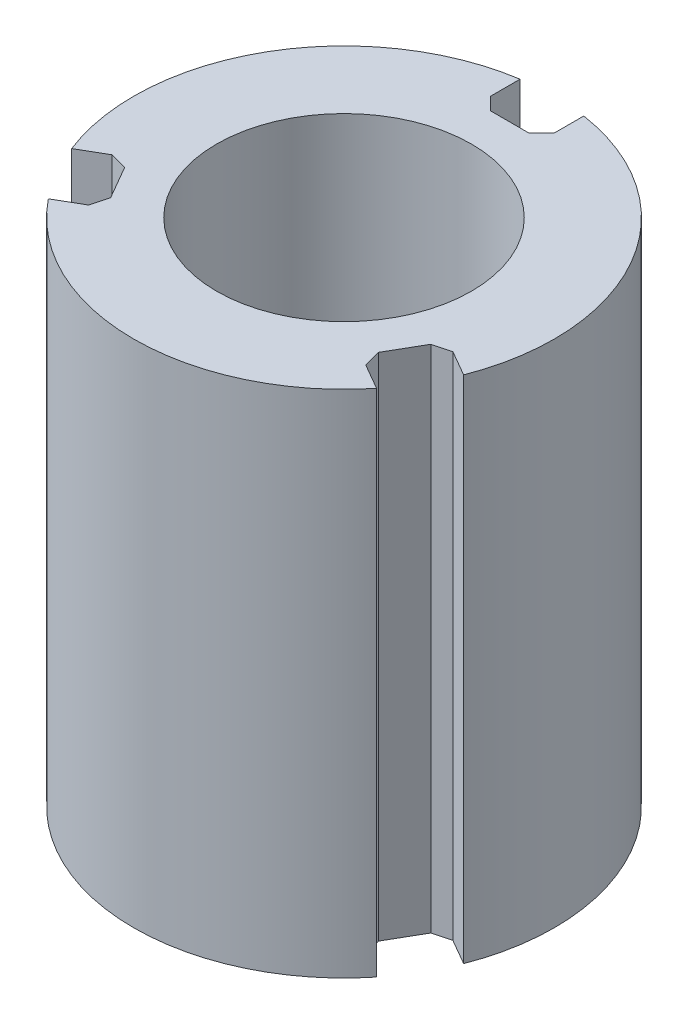
ISO-10303-21;
HEADER;
FILE_DESCRIPTION(('STEP AP214'),'2;1');
FILE_NAME('part.step','',(''),(''),'','','');
FILE_SCHEMA(('AUTOMOTIVE_DESIGN { 1 0 10303 214 1 1 1 1 }'));
ENDSEC;
DATA;
#1=APPLICATION_CONTEXT('core data for automotive mechanical design processes');
#2=APPLICATION_PROTOCOL_DEFINITION('international standard','automotive_design',2000,#1);
#3=PRODUCT_CONTEXT('',#1,'mechanical');
#4=PRODUCT('Part','Part','',(#3));
#5=PRODUCT_RELATED_PRODUCT_CATEGORY('part','',(#4));
#6=PRODUCT_DEFINITION_FORMATION('','',#4);
#7=PRODUCT_DEFINITION_CONTEXT('part definition',#1,'design');
#8=PRODUCT_DEFINITION('design','',#6,#7);
#9=PRODUCT_DEFINITION_SHAPE('','',#8);
#10=(LENGTH_UNIT() NAMED_UNIT(*) SI_UNIT(.MILLI.,.METRE.));
#11=(NAMED_UNIT(*) PLANE_ANGLE_UNIT() SI_UNIT($,.RADIAN.));
#12=(NAMED_UNIT(*) SI_UNIT($,.STERADIAN.) SOLID_ANGLE_UNIT());
#13=UNCERTAINTY_MEASURE_WITH_UNIT(LENGTH_MEASURE(1.E-05),#10,'distance_accuracy_value','');
#14=(GEOMETRIC_REPRESENTATION_CONTEXT(3) GLOBAL_UNCERTAINTY_ASSIGNED_CONTEXT((#13)) GLOBAL_UNIT_ASSIGNED_CONTEXT((#10,
#11,#12)) REPRESENTATION_CONTEXT('',''));
#15=CARTESIAN_POINT('',(0.,0.,0.));
#16=DIRECTION('',(0.,0.,1.));
#17=DIRECTION('',(1.,0.,0.));
#18=AXIS2_PLACEMENT_3D('',#15,#16,#17);
#19=CARTESIAN_POINT('',(0.,8.,0.));
#20=DIRECTION('',(0.,1.,0.));
#21=DIRECTION('',(0.,0.,1.));
#22=AXIS2_PLACEMENT_3D('',#19,#20,#21);
#23=PLANE('',#22);
#24=DIRECTION('',(0.,0.,-1.));
#25=VECTOR('',#24,1.);
#26=CARTESIAN_POINT('',(-0.5,8.,-3.26190128606002));
#27=LINE('',#26,#25);
#28=CARTESIAN_POINT('',(-0.5,8.,-2.8));
#29=VERTEX_POINT('',#28);
#30=CARTESIAN_POINT('',(-0.499999999999999,8.,-3.26190128606002));
#31=VERTEX_POINT('',#30);
#32=EDGE_CURVE('E259',#29,#31,#27,.T.);
#33=ORIENTED_EDGE('',*,*,#32,.T.);
#34=CARTESIAN_POINT('',(0.,8.,0.));
#35=DIRECTION('',(0.,1.,0.));
#36=DIRECTION('',(0.,0.,1.));
#37=AXIS2_PLACEMENT_3D('',#34,#35,#36);
#38=CIRCLE('',#37,3.3);
#39=CARTESIAN_POINT('',(-3.0748893783651,8.,1.19793794113779));
#40=VERTEX_POINT('',#39);
#41=EDGE_CURVE('E136',#31,#40,#38,.T.);
#42=ORIENTED_EDGE('',*,*,#41,.T.);
#43=DIRECTION('',(0.866025403784438,0.,-0.500000000000001));
#44=VECTOR('',#43,1.);
#45=CARTESIAN_POINT('',(-3.0748893783651,8.,1.19793794113779));
#46=LINE('',#45,#44);
#47=CARTESIAN_POINT('',(-2.67487113059642,8.,0.966987298107785));
#48=VERTEX_POINT('',#47);
#49=EDGE_CURVE('E321',#40,#48,#46,.T.);
#50=ORIENTED_EDGE('',*,*,#49,.T.);
#51=DIRECTION('',(0.965925826289068,0.,0.258819045102521));
#52=VECTOR('',#51,1.);
#53=CARTESIAN_POINT('',(-2.40166604983954,8.,1.04019237886467));
#54=LINE('',#53,#52);
#55=CARTESIAN_POINT('',(-2.40166604983954,8.,1.04019237886467));
#56=VERTEX_POINT('',#55);
#57=EDGE_CURVE('E342',#48,#56,#54,.T.);
#58=ORIENTED_EDGE('',*,*,#57,.T.);
#59=DIRECTION('',(0.5,0.,0.866025403784438));
#60=VECTOR('',#59,1.);
#61=CARTESIAN_POINT('',(-2.10166604983954,8.,1.55980762113534));
#62=LINE('',#61,#60);
#63=CARTESIAN_POINT('',(-2.10166604983954,8.,1.55980762113534));
#64=VERTEX_POINT('',#63);
#65=EDGE_CURVE('E340',#56,#64,#62,.T.);
#66=ORIENTED_EDGE('',*,*,#65,.T.);
#67=DIRECTION('',(-0.25881904510252,0.,0.965925826289068));
#68=VECTOR('',#67,1.);
#69=CARTESIAN_POINT('',(-2.17487113059642,8.,1.83301270189222));
#70=LINE('',#69,#68);
#71=CARTESIAN_POINT('',(-2.17487113059642,8.,1.83301270189222));
#72=VERTEX_POINT('',#71);
#73=EDGE_CURVE('E338',#64,#72,#70,.T.);
#74=ORIENTED_EDGE('',*,*,#73,.T.);
#75=DIRECTION('',(-0.866025403784438,0.,0.5));
#76=VECTOR('',#75,1.);
#77=CARTESIAN_POINT('',(-2.5748893783651,8.,2.06396334492223));
#78=LINE('',#77,#76);
#79=CARTESIAN_POINT('',(-2.5748893783651,8.,2.06396334492223));
#80=VERTEX_POINT('',#79);
#81=EDGE_CURVE('E343',#72,#80,#78,.T.);
#82=ORIENTED_EDGE('',*,*,#81,.T.);
#83=CARTESIAN_POINT('',(0.,8.,0.));
#84=DIRECTION('',(0.,1.,0.));
#85=DIRECTION('',(0.,0.,1.));
#86=AXIS2_PLACEMENT_3D('',#83,#84,#85);
#87=CIRCLE('',#86,3.3);
#88=CARTESIAN_POINT('',(2.57488937836511,8.,2.06396334492223));
#89=VERTEX_POINT('',#88);
#90=EDGE_CURVE('E355',#80,#89,#87,.T.);
#91=ORIENTED_EDGE('',*,*,#90,.T.);
#92=DIRECTION('',(-0.866025403784435,0.,-0.500000000000006));
#93=VECTOR('',#92,1.);
#94=CARTESIAN_POINT('',(2.57488937836511,8.,2.06396334492223));
#95=LINE('',#94,#93);
#96=CARTESIAN_POINT('',(2.17487113059643,8.,1.83301270189222));
#97=VERTEX_POINT('',#96);
#98=EDGE_CURVE('E352',#89,#97,#95,.T.);
#99=ORIENTED_EDGE('',*,*,#98,.T.);
#100=DIRECTION('',(-0.25881904510252,0.,-0.965925826289069));
#101=VECTOR('',#100,1.);
#102=CARTESIAN_POINT('',(2.10166604983954,8.,1.55980762113533));
#103=LINE('',#102,#101);
#104=CARTESIAN_POINT('',(2.10166604983954,8.,1.55980762113533));
#105=VERTEX_POINT('',#104);
#106=EDGE_CURVE('E358',#97,#105,#103,.T.);
#107=ORIENTED_EDGE('',*,*,#106,.T.);
#108=DIRECTION('',(0.5,0.,-0.866025403784439));
#109=VECTOR('',#108,1.);
#110=CARTESIAN_POINT('',(2.40166604983954,8.,1.04019237886466));
#111=LINE('',#110,#109);
#112=CARTESIAN_POINT('',(2.40166604983954,8.,1.04019237886466));
#113=VERTEX_POINT('',#112);
#114=EDGE_CURVE('E361',#105,#113,#111,.T.);
#115=ORIENTED_EDGE('',*,*,#114,.T.);
#116=DIRECTION('',(0.965925826289068,0.,-0.258819045102522));
#117=VECTOR('',#116,1.);
#118=CARTESIAN_POINT('',(2.67487113059643,8.,0.966987298107776));
#119=LINE('',#118,#117);
#120=CARTESIAN_POINT('',(2.67487113059643,8.,0.966987298107776));
#121=VERTEX_POINT('',#120);
#122=EDGE_CURVE('E362',#113,#121,#119,.T.);
#123=ORIENTED_EDGE('',*,*,#122,.T.);
#124=DIRECTION('',(0.866025403784439,0.,0.5));
#125=VECTOR('',#124,1.);
#126=CARTESIAN_POINT('',(3.07488937836511,8.,1.19793794113778));
#127=LINE('',#126,#125);
#128=CARTESIAN_POINT('',(3.07488937836511,8.,1.19793794113778));
#129=VERTEX_POINT('',#128);
#130=EDGE_CURVE('E370',#121,#129,#127,.T.);
#131=ORIENTED_EDGE('',*,*,#130,.T.);
#132=CARTESIAN_POINT('',(0.,8.,0.));
#133=DIRECTION('',(0.,1.,0.));
#134=DIRECTION('',(0.,0.,1.));
#135=AXIS2_PLACEMENT_3D('',#132,#133,#134);
#136=CIRCLE('',#135,3.3);
#137=CARTESIAN_POINT('',(0.5,8.,-3.26190128606002));
#138=VERTEX_POINT('',#137);
#139=EDGE_CURVE('E369',#129,#138,#136,.T.);
#140=ORIENTED_EDGE('',*,*,#139,.T.);
#141=DIRECTION('',(0.,0.,1.));
#142=VECTOR('',#141,1.);
#143=CARTESIAN_POINT('',(0.5,8.,-3.26190128606002));
#144=LINE('',#143,#142);
#145=CARTESIAN_POINT('',(0.5,8.,-2.8));
#146=VERTEX_POINT('',#145);
#147=EDGE_CURVE('E184',#138,#146,#144,.T.);
#148=ORIENTED_EDGE('',*,*,#147,.T.);
#149=DIRECTION('',(-0.707106781186547,0.,0.707106781186548));
#150=VECTOR('',#149,1.);
#151=CARTESIAN_POINT('',(0.3,8.,-2.6));
#152=LINE('',#151,#150);
#153=CARTESIAN_POINT('',(0.3,8.,-2.6));
#154=VERTEX_POINT('',#153);
#155=EDGE_CURVE('E177',#146,#154,#152,.T.);
#156=ORIENTED_EDGE('',*,*,#155,.T.);
#157=DIRECTION('',(-1.,0.,0.));
#158=VECTOR('',#157,1.);
#159=CARTESIAN_POINT('',(-0.3,8.,-2.6));
#160=LINE('',#159,#158);
#161=CARTESIAN_POINT('',(-0.3,8.,-2.6));
#162=VERTEX_POINT('',#161);
#163=EDGE_CURVE('E183',#154,#162,#160,.T.);
#164=ORIENTED_EDGE('',*,*,#163,.T.);
#165=DIRECTION('',(-0.707106781186547,0.,-0.707106781186548));
#166=VECTOR('',#165,1.);
#167=CARTESIAN_POINT('',(-0.5,8.,-2.8));
#168=LINE('',#167,#166);
#169=EDGE_CURVE('E65',#162,#29,#168,.T.);
#170=ORIENTED_EDGE('',*,*,#169,.T.);
#171=EDGE_LOOP('',(#33,#42,#50,#58,#66,#74,#82,#91,#99,#107,#115,#123,#131,#140,#148,#156,#164,#170));
#172=FACE_BOUND('',#171,.T.);
#173=CARTESIAN_POINT('',(0.,8.,0.));
#174=DIRECTION('',(0.,1.,0.));
#175=DIRECTION('',(0.,0.,1.));
#176=AXIS2_PLACEMENT_3D('',#173,#174,#175);
#177=CIRCLE('',#176,2.);
#178=CARTESIAN_POINT('',(0.,8.,2.));
#179=VERTEX_POINT('',#178);
#180=EDGE_CURVE('E212',#179,#179,#177,.T.);
#181=ORIENTED_EDGE('',*,*,#180,.F.);
#182=EDGE_LOOP('',(#181));
#183=FACE_BOUND('',#182,.T.);
#184=ADVANCED_FACE('F44',(#172,#183),#23,.T.);
#185=CARTESIAN_POINT('',(0.,0.,0.));
#186=DIRECTION('',(0.,1.,0.));
#187=DIRECTION('',(0.,0.,1.));
#188=AXIS2_PLACEMENT_3D('',#185,#186,#187);
#189=PLANE('',#188);
#190=DIRECTION('',(0.,0.,-1.));
#191=VECTOR('',#190,1.);
#192=CARTESIAN_POINT('',(-0.5,0.,-3.26190128606002));
#193=LINE('',#192,#191);
#194=CARTESIAN_POINT('',(-0.5,0.,-2.8));
#195=VERTEX_POINT('',#194);
#196=CARTESIAN_POINT('',(-0.499999999999999,0.,-3.26190128606002));
#197=VERTEX_POINT('',#196);
#198=EDGE_CURVE('E209',#195,#197,#193,.T.);
#199=ORIENTED_EDGE('',*,*,#198,.F.);
#200=DIRECTION('',(-0.707106781186547,0.,-0.707106781186548));
#201=VECTOR('',#200,1.);
#202=CARTESIAN_POINT('',(-0.5,0.,-2.8));
#203=LINE('',#202,#201);
#204=CARTESIAN_POINT('',(-0.3,0.,-2.6));
#205=VERTEX_POINT('',#204);
#206=EDGE_CURVE('E126',#205,#195,#203,.T.);
#207=ORIENTED_EDGE('',*,*,#206,.F.);
#208=DIRECTION('',(-1.,0.,0.));
#209=VECTOR('',#208,1.);
#210=CARTESIAN_POINT('',(-0.3,0.,-2.6));
#211=LINE('',#210,#209);
#212=CARTESIAN_POINT('',(0.3,0.,-2.6));
#213=VERTEX_POINT('',#212);
#214=EDGE_CURVE('E122',#213,#205,#211,.T.);
#215=ORIENTED_EDGE('',*,*,#214,.F.);
#216=DIRECTION('',(-0.707106781186547,0.,0.707106781186548));
#217=VECTOR('',#216,1.);
#218=CARTESIAN_POINT('',(0.3,0.,-2.6));
#219=LINE('',#218,#217);
#220=CARTESIAN_POINT('',(0.5,0.,-2.8));
#221=VERTEX_POINT('',#220);
#222=EDGE_CURVE('E191',#221,#213,#219,.T.);
#223=ORIENTED_EDGE('',*,*,#222,.F.);
#224=DIRECTION('',(0.,0.,1.));
#225=VECTOR('',#224,1.);
#226=CARTESIAN_POINT('',(0.5,0.,-3.26190128606002));
#227=LINE('',#226,#225);
#228=CARTESIAN_POINT('',(0.5,0.,-3.26190128606002));
#229=VERTEX_POINT('',#228);
#230=EDGE_CURVE('E252',#229,#221,#227,.T.);
#231=ORIENTED_EDGE('',*,*,#230,.F.);
#232=CARTESIAN_POINT('',(0.,0.,0.));
#233=DIRECTION('',(0.,1.,0.));
#234=DIRECTION('',(0.,0.,1.));
#235=AXIS2_PLACEMENT_3D('',#232,#233,#234);
#236=CIRCLE('',#235,3.3);
#237=CARTESIAN_POINT('',(3.07488937836511,0.,1.19793794113778));
#238=VERTEX_POINT('',#237);
#239=EDGE_CURVE('E246',#238,#229,#236,.T.);
#240=ORIENTED_EDGE('',*,*,#239,.F.);
#241=DIRECTION('',(0.866025403784439,0.,0.5));
#242=VECTOR('',#241,1.);
#243=CARTESIAN_POINT('',(3.07488937836511,0.,1.19793794113778));
#244=LINE('',#243,#242);
#245=CARTESIAN_POINT('',(2.67487113059643,0.,0.966987298107776));
#246=VERTEX_POINT('',#245);
#247=EDGE_CURVE('E243',#246,#238,#244,.T.);
#248=ORIENTED_EDGE('',*,*,#247,.F.);
#249=DIRECTION('',(0.965925826289068,0.,-0.258819045102522));
#250=VECTOR('',#249,1.);
#251=CARTESIAN_POINT('',(2.67487113059643,0.,0.966987298107776));
#252=LINE('',#251,#250);
#253=CARTESIAN_POINT('',(2.40166604983954,0.,1.04019237886466));
#254=VERTEX_POINT('',#253);
#255=EDGE_CURVE('E244',#254,#246,#252,.T.);
#256=ORIENTED_EDGE('',*,*,#255,.F.);
#257=DIRECTION('',(0.5,0.,-0.866025403784439));
#258=VECTOR('',#257,1.);
#259=CARTESIAN_POINT('',(2.40166604983954,0.,1.04019237886466));
#260=LINE('',#259,#258);
#261=CARTESIAN_POINT('',(2.10166604983954,0.,1.55980762113533));
#262=VERTEX_POINT('',#261);
#263=EDGE_CURVE('E236',#262,#254,#260,.T.);
#264=ORIENTED_EDGE('',*,*,#263,.F.);
#265=DIRECTION('',(-0.25881904510252,0.,-0.965925826289069));
#266=VECTOR('',#265,1.);
#267=CARTESIAN_POINT('',(2.10166604983954,0.,1.55980762113533));
#268=LINE('',#267,#266);
#269=CARTESIAN_POINT('',(2.17487113059643,0.,1.83301270189222));
#270=VERTEX_POINT('',#269);
#271=EDGE_CURVE('E237',#270,#262,#268,.T.);
#272=ORIENTED_EDGE('',*,*,#271,.F.);
#273=DIRECTION('',(-0.866025403784435,0.,-0.500000000000006));
#274=VECTOR('',#273,1.);
#275=CARTESIAN_POINT('',(2.57488937836511,0.,2.06396334492223));
#276=LINE('',#275,#274);
#277=CARTESIAN_POINT('',(2.57488937836511,0.,2.06396334492223));
#278=VERTEX_POINT('',#277);
#279=EDGE_CURVE('E232',#278,#270,#276,.T.);
#280=ORIENTED_EDGE('',*,*,#279,.F.);
#281=CARTESIAN_POINT('',(0.,0.,0.));
#282=DIRECTION('',(0.,1.,0.));
#283=DIRECTION('',(0.,0.,1.));
#284=AXIS2_PLACEMENT_3D('',#281,#282,#283);
#285=CIRCLE('',#284,3.3);
#286=CARTESIAN_POINT('',(-2.5748893783651,0.,2.06396334492223));
#287=VERTEX_POINT('',#286);
#288=EDGE_CURVE('E229',#287,#278,#285,.T.);
#289=ORIENTED_EDGE('',*,*,#288,.F.);
#290=DIRECTION('',(-0.866025403784438,0.,0.5));
#291=VECTOR('',#290,1.);
#292=CARTESIAN_POINT('',(-2.5748893783651,0.,2.06396334492223));
#293=LINE('',#292,#291);
#294=CARTESIAN_POINT('',(-2.17487113059642,0.,1.83301270189222));
#295=VERTEX_POINT('',#294);
#296=EDGE_CURVE('E230',#295,#287,#293,.T.);
#297=ORIENTED_EDGE('',*,*,#296,.F.);
#298=DIRECTION('',(-0.25881904510252,0.,0.965925826289068));
#299=VECTOR('',#298,1.);
#300=CARTESIAN_POINT('',(-2.17487113059642,0.,1.83301270189222));
#301=LINE('',#300,#299);
#302=CARTESIAN_POINT('',(-2.10166604983954,0.,1.55980762113534));
#303=VERTEX_POINT('',#302);
#304=EDGE_CURVE('E222',#303,#295,#301,.T.);
#305=ORIENTED_EDGE('',*,*,#304,.F.);
#306=DIRECTION('',(0.5,0.,0.866025403784438));
#307=VECTOR('',#306,1.);
#308=CARTESIAN_POINT('',(-2.10166604983954,0.,1.55980762113534));
#309=LINE('',#308,#307);
#310=CARTESIAN_POINT('',(-2.40166604983954,0.,1.04019237886467));
#311=VERTEX_POINT('',#310);
#312=EDGE_CURVE('E221',#311,#303,#309,.T.);
#313=ORIENTED_EDGE('',*,*,#312,.F.);
#314=DIRECTION('',(0.965925826289068,0.,0.258819045102521));
#315=VECTOR('',#314,1.);
#316=CARTESIAN_POINT('',(-2.40166604983954,0.,1.04019237886467));
#317=LINE('',#316,#315);
#318=CARTESIAN_POINT('',(-2.67487113059642,0.,0.966987298107785));
#319=VERTEX_POINT('',#318);
#320=EDGE_CURVE('E216',#319,#311,#317,.T.);
#321=ORIENTED_EDGE('',*,*,#320,.F.);
#322=DIRECTION('',(0.866025403784438,0.,-0.500000000000001));
#323=VECTOR('',#322,1.);
#324=CARTESIAN_POINT('',(-3.0748893783651,0.,1.19793794113779));
#325=LINE('',#324,#323);
#326=CARTESIAN_POINT('',(-3.0748893783651,0.,1.19793794113779));
#327=VERTEX_POINT('',#326);
#328=EDGE_CURVE('E214',#327,#319,#325,.T.);
#329=ORIENTED_EDGE('',*,*,#328,.F.);
#330=CARTESIAN_POINT('',(0.,0.,0.));
#331=DIRECTION('',(0.,1.,0.));
#332=DIRECTION('',(0.,0.,1.));
#333=AXIS2_PLACEMENT_3D('',#330,#331,#332);
#334=CIRCLE('',#333,3.3);
#335=EDGE_CURVE('E213',#197,#327,#334,.T.);
#336=ORIENTED_EDGE('',*,*,#335,.F.);
#337=EDGE_LOOP('',(#199,#207,#215,#223,#231,#240,#248,#256,#264,#272,#280,#289,#297,#305,#313,
#321,#329,#336));
#338=FACE_BOUND('',#337,.T.);
#339=CARTESIAN_POINT('',(0.,0.,0.));
#340=DIRECTION('',(0.,1.,0.));
#341=DIRECTION('',(0.,0.,1.));
#342=AXIS2_PLACEMENT_3D('',#339,#340,#341);
#343=CIRCLE('',#342,2.);
#344=CARTESIAN_POINT('',(0.,0.,2.));
#345=VERTEX_POINT('',#344);
#346=EDGE_CURVE('E600',#345,#345,#343,.T.);
#347=ORIENTED_EDGE('',*,*,#346,.T.);
#348=EDGE_LOOP('',(#347));
#349=FACE_BOUND('',#348,.T.);
#350=ADVANCED_FACE('F324',(#338,#349),#189,.F.);
#351=CARTESIAN_POINT('',(-0.5,8.,-3.26190128606002));
#352=DIRECTION('',(-1.,0.,0.));
#353=DIRECTION('',(0.,0.,1.));
#354=AXIS2_PLACEMENT_3D('',#351,#352,#353);
#355=PLANE('',#354);
#356=ORIENTED_EDGE('',*,*,#198,.T.);
#357=DIRECTION('',(0.,-1.,0.));
#358=VECTOR('',#357,1.);
#359=CARTESIAN_POINT('',(-0.499999999999999,8.,-3.26190128606002));
#360=LINE('',#359,#358);
#361=EDGE_CURVE('E11',#31,#197,#360,.T.);
#362=ORIENTED_EDGE('',*,*,#361,.F.);
#363=ORIENTED_EDGE('',*,*,#32,.F.);
#364=DIRECTION('',(0.,-1.,0.));
#365=VECTOR('',#364,1.);
#366=CARTESIAN_POINT('',(-0.5,8.,-2.8));
#367=LINE('',#366,#365);
#368=EDGE_CURVE('E201',#29,#195,#367,.T.);
#369=ORIENTED_EDGE('',*,*,#368,.T.);
#370=EDGE_LOOP('',(#356,#362,#363,#369));
#371=FACE_BOUND('',#370,.T.);
#372=ADVANCED_FACE('F50',(#371),#355,.F.);
#373=CARTESIAN_POINT('',(0.,8.,0.));
#374=DIRECTION('',(0.,-1.,0.));
#375=DIRECTION('',(0.,0.,-1.));
#376=AXIS2_PLACEMENT_3D('',#373,#374,#375);
#377=CYLINDRICAL_SURFACE('',#376,3.3);
#378=ORIENTED_EDGE('',*,*,#335,.T.);
#379=DIRECTION('',(0.,-1.,0.));
#380=VECTOR('',#379,1.);
#381=CARTESIAN_POINT('',(-3.0748893783651,8.,1.19793794113779));
#382=LINE('',#381,#380);
#383=EDGE_CURVE('E54',#40,#327,#382,.T.);
#384=ORIENTED_EDGE('',*,*,#383,.F.);
#385=ORIENTED_EDGE('',*,*,#41,.F.);
#386=ORIENTED_EDGE('',*,*,#361,.T.);
#387=EDGE_LOOP('',(#378,#384,#385,#386));
#388=FACE_BOUND('',#387,.T.);
#389=ADVANCED_FACE('F406',(#388),#377,.T.);
#390=CARTESIAN_POINT('',(-3.0748893783651,8.,1.19793794113779));
#391=DIRECTION('',(-0.500000000000001,0.,-0.866025403784438));
#392=DIRECTION('',(-0.866025403784438,0.,0.500000000000001));
#393=AXIS2_PLACEMENT_3D('',#390,#391,#392);
#394=PLANE('',#393);
#395=ORIENTED_EDGE('',*,*,#328,.T.);
#396=DIRECTION('',(0.,-1.,0.));
#397=VECTOR('',#396,1.);
#398=CARTESIAN_POINT('',(-2.67487113059642,8.,0.966987298107785));
#399=LINE('',#398,#397);
#400=EDGE_CURVE('E311',#48,#319,#399,.T.);
#401=ORIENTED_EDGE('',*,*,#400,.F.);
#402=ORIENTED_EDGE('',*,*,#49,.F.);
#403=ORIENTED_EDGE('',*,*,#383,.T.);
#404=EDGE_LOOP('',(#395,#401,#402,#403));
#405=FACE_BOUND('',#404,.T.);
#406=ADVANCED_FACE('F317',(#405),#394,.F.);
#407=CARTESIAN_POINT('',(-2.40166604983954,8.,1.04019237886467));
#408=DIRECTION('',(0.258819045102521,0.,-0.965925826289068));
#409=DIRECTION('',(-0.965925826289068,0.,-0.258819045102521));
#410=AXIS2_PLACEMENT_3D('',#407,#408,#409);
#411=PLANE('',#410);
#412=ORIENTED_EDGE('',*,*,#320,.T.);
#413=DIRECTION('',(0.,-1.,0.));
#414=VECTOR('',#413,1.);
#415=CARTESIAN_POINT('',(-2.40166604983954,8.,1.04019237886467));
#416=LINE('',#415,#414);
#417=EDGE_CURVE('E310',#56,#311,#416,.T.);
#418=ORIENTED_EDGE('',*,*,#417,.F.);
#419=ORIENTED_EDGE('',*,*,#57,.F.);
#420=ORIENTED_EDGE('',*,*,#400,.T.);
#421=EDGE_LOOP('',(#412,#418,#419,#420));
#422=FACE_BOUND('',#421,.T.);
#423=ADVANCED_FACE('F332',(#422),#411,.F.);
#424=CARTESIAN_POINT('',(-2.10166604983954,8.,1.55980762113534));
#425=DIRECTION('',(0.866025403784438,0.,-0.5));
#426=DIRECTION('',(-0.5,0.,-0.866025403784438));
#427=AXIS2_PLACEMENT_3D('',#424,#425,#426);
#428=PLANE('',#427);
#429=ORIENTED_EDGE('',*,*,#312,.T.);
#430=DIRECTION('',(0.,-1.,0.));
#431=VECTOR('',#430,1.);
#432=CARTESIAN_POINT('',(-2.10166604983954,8.,1.55980762113534));
#433=LINE('',#432,#431);
#434=EDGE_CURVE('E301',#64,#303,#433,.T.);
#435=ORIENTED_EDGE('',*,*,#434,.F.);
#436=ORIENTED_EDGE('',*,*,#65,.F.);
#437=ORIENTED_EDGE('',*,*,#417,.T.);
#438=EDGE_LOOP('',(#429,#435,#436,#437));
#439=FACE_BOUND('',#438,.T.);
#440=ADVANCED_FACE('F333',(#439),#428,.F.);
#441=CARTESIAN_POINT('',(-2.17487113059642,8.,1.83301270189222));
#442=DIRECTION('',(0.965925826289069,0.,0.25881904510252));
#443=DIRECTION('',(0.25881904510252,0.,-0.965925826289069));
#444=AXIS2_PLACEMENT_3D('',#441,#442,#443);
#445=PLANE('',#444);
#446=ORIENTED_EDGE('',*,*,#304,.T.);
#447=DIRECTION('',(0.,-1.,0.));
#448=VECTOR('',#447,1.);
#449=CARTESIAN_POINT('',(-2.17487113059642,8.,1.83301270189222));
#450=LINE('',#449,#448);
#451=EDGE_CURVE('E296',#72,#295,#450,.T.);
#452=ORIENTED_EDGE('',*,*,#451,.F.);
#453=ORIENTED_EDGE('',*,*,#73,.F.);
#454=ORIENTED_EDGE('',*,*,#434,.T.);
#455=EDGE_LOOP('',(#446,#452,#453,#454));
#456=FACE_BOUND('',#455,.T.);
#457=ADVANCED_FACE('F416',(#456),#445,.F.);
#458=CARTESIAN_POINT('',(-2.5748893783651,8.,2.06396334492223));
#459=DIRECTION('',(0.5,0.,0.866025403784438));
#460=DIRECTION('',(0.866025403784439,0.,-0.5));
#461=AXIS2_PLACEMENT_3D('',#458,#459,#460);
#462=PLANE('',#461);
#463=ORIENTED_EDGE('',*,*,#296,.T.);
#464=DIRECTION('',(0.,-1.,0.));
#465=VECTOR('',#464,1.);
#466=CARTESIAN_POINT('',(-2.5748893783651,8.,2.06396334492223));
#467=LINE('',#466,#465);
#468=EDGE_CURVE('E293',#80,#287,#467,.T.);
#469=ORIENTED_EDGE('',*,*,#468,.F.);
#470=ORIENTED_EDGE('',*,*,#81,.F.);
#471=ORIENTED_EDGE('',*,*,#451,.T.);
#472=EDGE_LOOP('',(#463,#469,#470,#471));
#473=FACE_BOUND('',#472,.T.);
#474=ADVANCED_FACE('F424',(#473),#462,.F.);
#475=CARTESIAN_POINT('',(0.,8.,0.));
#476=DIRECTION('',(0.,-1.,0.));
#477=DIRECTION('',(0.,0.,-1.));
#478=AXIS2_PLACEMENT_3D('',#475,#476,#477);
#479=CYLINDRICAL_SURFACE('',#478,3.3);
#480=ORIENTED_EDGE('',*,*,#288,.T.);
#481=DIRECTION('',(0.,-1.,0.));
#482=VECTOR('',#481,1.);
#483=CARTESIAN_POINT('',(2.57488937836511,8.,2.06396334492223));
#484=LINE('',#483,#482);
#485=EDGE_CURVE('E292',#89,#278,#484,.T.);
#486=ORIENTED_EDGE('',*,*,#485,.F.);
#487=ORIENTED_EDGE('',*,*,#90,.F.);
#488=ORIENTED_EDGE('',*,*,#468,.T.);
#489=EDGE_LOOP('',(#480,#486,#487,#488));
#490=FACE_BOUND('',#489,.T.);
#491=ADVANCED_FACE('F427',(#490),#479,.T.);
#492=CARTESIAN_POINT('',(2.57488937836511,8.,2.06396334492223));
#493=DIRECTION('',(-0.500000000000006,0.,0.866025403784435));
#494=DIRECTION('',(0.866025403784435,0.,0.500000000000006));
#495=AXIS2_PLACEMENT_3D('',#492,#493,#494);
#496=PLANE('',#495);
#497=ORIENTED_EDGE('',*,*,#279,.T.);
#498=DIRECTION('',(0.,-1.,0.));
#499=VECTOR('',#498,1.);
#500=CARTESIAN_POINT('',(2.17487113059643,8.,1.83301270189222));
#501=LINE('',#500,#499);
#502=EDGE_CURVE('E289',#97,#270,#501,.T.);
#503=ORIENTED_EDGE('',*,*,#502,.F.);
#504=ORIENTED_EDGE('',*,*,#98,.F.);
#505=ORIENTED_EDGE('',*,*,#485,.T.);
#506=EDGE_LOOP('',(#497,#503,#504,#505));
#507=FACE_BOUND('',#506,.T.);
#508=ADVANCED_FACE('F428',(#507),#496,.F.);
#509=CARTESIAN_POINT('',(2.10166604983954,8.,1.55980762113533));
#510=DIRECTION('',(-0.965925826289069,0.,0.25881904510252));
#511=DIRECTION('',(0.25881904510252,0.,0.965925826289069));
#512=AXIS2_PLACEMENT_3D('',#509,#510,#511);
#513=PLANE('',#512);
#514=ORIENTED_EDGE('',*,*,#271,.T.);
#515=DIRECTION('',(0.,-1.,0.));
#516=VECTOR('',#515,1.);
#517=CARTESIAN_POINT('',(2.10166604983954,8.,1.55980762113533));
#518=LINE('',#517,#516);
#519=EDGE_CURVE('E284',#105,#262,#518,.T.);
#520=ORIENTED_EDGE('',*,*,#519,.F.);
#521=ORIENTED_EDGE('',*,*,#106,.F.);
#522=ORIENTED_EDGE('',*,*,#502,.T.);
#523=EDGE_LOOP('',(#514,#520,#521,#522));
#524=FACE_BOUND('',#523,.T.);
#525=ADVANCED_FACE('F431',(#524),#513,.F.);
#526=CARTESIAN_POINT('',(2.40166604983954,8.,1.04019237886466));
#527=DIRECTION('',(-0.866025403784439,0.,-0.5));
#528=DIRECTION('',(-0.5,0.,0.866025403784439));
#529=AXIS2_PLACEMENT_3D('',#526,#527,#528);
#530=PLANE('',#529);
#531=ORIENTED_EDGE('',*,*,#263,.T.);
#532=DIRECTION('',(0.,-1.,0.));
#533=VECTOR('',#532,1.);
#534=CARTESIAN_POINT('',(2.40166604983954,8.,1.04019237886466));
#535=LINE('',#534,#533);
#536=EDGE_CURVE('E278',#113,#254,#535,.T.);
#537=ORIENTED_EDGE('',*,*,#536,.F.);
#538=ORIENTED_EDGE('',*,*,#114,.F.);
#539=ORIENTED_EDGE('',*,*,#519,.T.);
#540=EDGE_LOOP('',(#531,#537,#538,#539));
#541=FACE_BOUND('',#540,.T.);
#542=ADVANCED_FACE('F436',(#541),#530,.F.);
#543=CARTESIAN_POINT('',(2.67487113059643,8.,0.966987298107776));
#544=DIRECTION('',(-0.258819045102522,0.,-0.965925826289068));
#545=DIRECTION('',(-0.965925826289068,0.,0.258819045102522));
#546=AXIS2_PLACEMENT_3D('',#543,#544,#545);
#547=PLANE('',#546);
#548=ORIENTED_EDGE('',*,*,#255,.T.);
#549=DIRECTION('',(0.,-1.,0.));
#550=VECTOR('',#549,1.);
#551=CARTESIAN_POINT('',(2.67487113059643,8.,0.966987298107776));
#552=LINE('',#551,#550);
#553=EDGE_CURVE('E274',#121,#246,#552,.T.);
#554=ORIENTED_EDGE('',*,*,#553,.F.);
#555=ORIENTED_EDGE('',*,*,#122,.F.);
#556=ORIENTED_EDGE('',*,*,#536,.T.);
#557=EDGE_LOOP('',(#548,#554,#555,#556));
#558=FACE_BOUND('',#557,.T.);
#559=ADVANCED_FACE('F445',(#558),#547,.F.);
#560=CARTESIAN_POINT('',(3.07488937836511,8.,1.19793794113778));
#561=DIRECTION('',(0.5,0.,-0.866025403784439));
#562=DIRECTION('',(-0.866025403784439,0.,-0.5));
#563=AXIS2_PLACEMENT_3D('',#560,#561,#562);
#564=PLANE('',#563);
#565=ORIENTED_EDGE('',*,*,#247,.T.);
#566=DIRECTION('',(0.,-1.,0.));
#567=VECTOR('',#566,1.);
#568=CARTESIAN_POINT('',(3.07488937836511,8.,1.19793794113778));
#569=LINE('',#568,#567);
#570=EDGE_CURVE('E271',#129,#238,#569,.T.);
#571=ORIENTED_EDGE('',*,*,#570,.F.);
#572=ORIENTED_EDGE('',*,*,#130,.F.);
#573=ORIENTED_EDGE('',*,*,#553,.T.);
#574=EDGE_LOOP('',(#565,#571,#572,#573));
#575=FACE_BOUND('',#574,.T.);
#576=ADVANCED_FACE('F446',(#575),#564,.F.);
#577=CARTESIAN_POINT('',(0.,8.,0.));
#578=DIRECTION('',(0.,-1.,0.));
#579=DIRECTION('',(0.,0.,-1.));
#580=AXIS2_PLACEMENT_3D('',#577,#578,#579);
#581=CYLINDRICAL_SURFACE('',#580,3.3);
#582=ORIENTED_EDGE('',*,*,#239,.T.);
#583=DIRECTION('',(0.,-1.,0.));
#584=VECTOR('',#583,1.);
#585=CARTESIAN_POINT('',(0.5,8.,-3.26190128606002));
#586=LINE('',#585,#584);
#587=EDGE_CURVE('E270',#138,#229,#586,.T.);
#588=ORIENTED_EDGE('',*,*,#587,.F.);
#589=ORIENTED_EDGE('',*,*,#139,.F.);
#590=ORIENTED_EDGE('',*,*,#570,.T.);
#591=EDGE_LOOP('',(#582,#588,#589,#590));
#592=FACE_BOUND('',#591,.T.);
#593=ADVANCED_FACE('F380',(#592),#581,.T.);
#594=CARTESIAN_POINT('',(0.5,8.,-3.26190128606002));
#595=DIRECTION('',(1.,0.,0.));
#596=DIRECTION('',(0.,0.,-1.));
#597=AXIS2_PLACEMENT_3D('',#594,#595,#596);
#598=PLANE('',#597);
#599=ORIENTED_EDGE('',*,*,#230,.T.);
#600=DIRECTION('',(0.,-1.,0.));
#601=VECTOR('',#600,1.);
#602=CARTESIAN_POINT('',(0.5,8.,-2.8));
#603=LINE('',#602,#601);
#604=EDGE_CURVE('E197',#146,#221,#603,.T.);
#605=ORIENTED_EDGE('',*,*,#604,.F.);
#606=ORIENTED_EDGE('',*,*,#147,.F.);
#607=ORIENTED_EDGE('',*,*,#587,.T.);
#608=EDGE_LOOP('',(#599,#605,#606,#607));
#609=FACE_BOUND('',#608,.T.);
#610=ADVANCED_FACE('F385',(#609),#598,.F.);
#611=CARTESIAN_POINT('',(0.3,8.,-2.6));
#612=DIRECTION('',(0.707106781186548,0.,0.707106781186547));
#613=DIRECTION('',(0.707106781186547,0.,-0.707106781186548));
#614=AXIS2_PLACEMENT_3D('',#611,#612,#613);
#615=PLANE('',#614);
#616=ORIENTED_EDGE('',*,*,#222,.T.);
#617=DIRECTION('',(0.,-1.,0.));
#618=VECTOR('',#617,1.);
#619=CARTESIAN_POINT('',(0.3,8.,-2.6));
#620=LINE('',#619,#618);
#621=EDGE_CURVE('E192',#154,#213,#620,.T.);
#622=ORIENTED_EDGE('',*,*,#621,.F.);
#623=ORIENTED_EDGE('',*,*,#155,.F.);
#624=ORIENTED_EDGE('',*,*,#604,.T.);
#625=EDGE_LOOP('',(#616,#622,#623,#624));
#626=FACE_BOUND('',#625,.T.);
#627=ADVANCED_FACE('F195',(#626),#615,.F.);
#628=CARTESIAN_POINT('',(-0.3,8.,-2.6));
#629=DIRECTION('',(0.,0.,1.));
#630=DIRECTION('',(1.,0.,0.));
#631=AXIS2_PLACEMENT_3D('',#628,#629,#630);
#632=PLANE('',#631);
#633=ORIENTED_EDGE('',*,*,#214,.T.);
#634=DIRECTION('',(0.,-1.,0.));
#635=VECTOR('',#634,1.);
#636=CARTESIAN_POINT('',(-0.3,8.,-2.6));
#637=LINE('',#636,#635);
#638=EDGE_CURVE('E199',#162,#205,#637,.T.);
#639=ORIENTED_EDGE('',*,*,#638,.F.);
#640=ORIENTED_EDGE('',*,*,#163,.F.);
#641=ORIENTED_EDGE('',*,*,#621,.T.);
#642=EDGE_LOOP('',(#633,#639,#640,#641));
#643=FACE_BOUND('',#642,.T.);
#644=ADVANCED_FACE('F196',(#643),#632,.F.);
#645=CARTESIAN_POINT('',(-0.5,8.,-2.8));
#646=DIRECTION('',(-0.707106781186548,0.,0.707106781186547));
#647=DIRECTION('',(0.707106781186547,0.,0.707106781186548));
#648=AXIS2_PLACEMENT_3D('',#645,#646,#647);
#649=PLANE('',#648);
#650=ORIENTED_EDGE('',*,*,#206,.T.);
#651=ORIENTED_EDGE('',*,*,#368,.F.);
#652=ORIENTED_EDGE('',*,*,#169,.F.);
#653=ORIENTED_EDGE('',*,*,#638,.T.);
#654=EDGE_LOOP('',(#650,#651,#652,#653));
#655=FACE_BOUND('',#654,.T.);
#656=ADVANCED_FACE('F387',(#655),#649,.F.);
#657=CARTESIAN_POINT('',(0.,8.,0.));
#658=DIRECTION('',(0.,-1.,0.));
#659=DIRECTION('',(0.,0.,-1.));
#660=AXIS2_PLACEMENT_3D('',#657,#658,#659);
#661=CYLINDRICAL_SURFACE('',#660,2.);
#662=ORIENTED_EDGE('',*,*,#180,.T.);
#663=EDGE_LOOP('',(#662));
#664=FACE_BOUND('',#663,.T.);
#665=ORIENTED_EDGE('',*,*,#346,.F.);
#666=EDGE_LOOP('',(#665));
#667=FACE_BOUND('',#666,.T.);
#668=ADVANCED_FACE('F390',(#664,#667),#661,.F.);
#669=CLOSED_SHELL('',(#184,#350,#372,#389,#406,#423,#440,#457,#474,#491,#508,#525,#542,#559,
#576,#593,#610,#627,#644,#656,#668));
#670=MANIFOLD_SOLID_BREP('B2',#669);
#671=ADVANCED_BREP_SHAPE_REPRESENTATION('',(#18,#670),#14);
#672=SHAPE_DEFINITION_REPRESENTATION(#9,#671);
ENDSEC;
END-ISO-10303-21;
